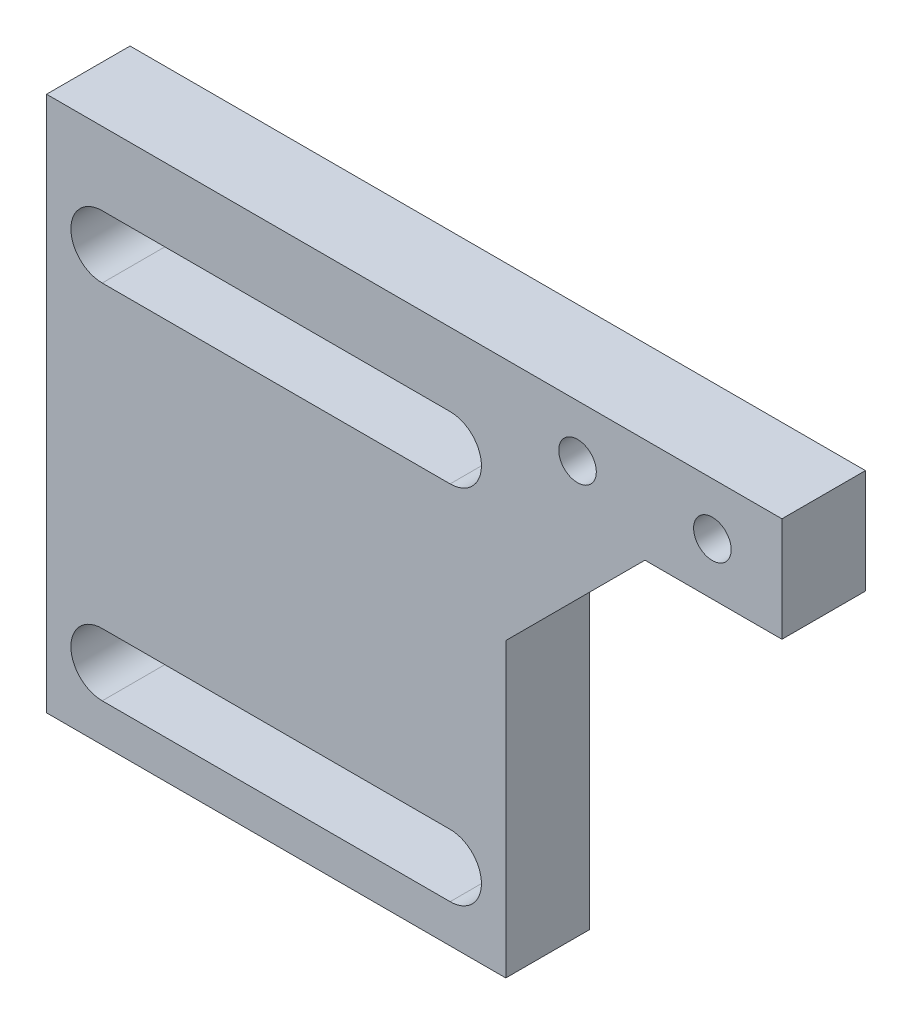
ISO-10303-21;
HEADER;
FILE_DESCRIPTION(('STEP AP214'),'2;1');
FILE_NAME('part.step','',(''),(''),'','','');
FILE_SCHEMA(('AUTOMOTIVE_DESIGN { 1 0 10303 214 1 1 1 1 }'));
ENDSEC;
DATA;
#1=APPLICATION_CONTEXT('core data for automotive mechanical design processes');
#2=APPLICATION_PROTOCOL_DEFINITION('international standard','automotive_design',2000,#1);
#3=PRODUCT_CONTEXT('',#1,'mechanical');
#4=PRODUCT('Part','Part','',(#3));
#5=PRODUCT_RELATED_PRODUCT_CATEGORY('part','',(#4));
#6=PRODUCT_DEFINITION_FORMATION('','',#4);
#7=PRODUCT_DEFINITION_CONTEXT('part definition',#1,'design');
#8=PRODUCT_DEFINITION('design','',#6,#7);
#9=PRODUCT_DEFINITION_SHAPE('','',#8);
#10=(LENGTH_UNIT() NAMED_UNIT(*) SI_UNIT(.MILLI.,.METRE.));
#11=(NAMED_UNIT(*) PLANE_ANGLE_UNIT() SI_UNIT($,.RADIAN.));
#12=(NAMED_UNIT(*) SI_UNIT($,.STERADIAN.) SOLID_ANGLE_UNIT());
#13=UNCERTAINTY_MEASURE_WITH_UNIT(LENGTH_MEASURE(1.E-05),#10,'distance_accuracy_value','');
#14=(GEOMETRIC_REPRESENTATION_CONTEXT(3) GLOBAL_UNCERTAINTY_ASSIGNED_CONTEXT((#13)) GLOBAL_UNIT_ASSIGNED_CONTEXT((#10,
#11,#12)) REPRESENTATION_CONTEXT('',''));
#15=CARTESIAN_POINT('',(0.,0.,0.));
#16=DIRECTION('',(0.,0.,1.));
#17=DIRECTION('',(1.,0.,0.));
#18=AXIS2_PLACEMENT_3D('',#15,#16,#17);
#19=CARTESIAN_POINT('',(0.,0.,6.));
#20=DIRECTION('',(0.,0.,-1.));
#21=DIRECTION('',(-1.,0.,0.));
#22=AXIS2_PLACEMENT_3D('',#19,#20,#21);
#23=PLANE('',#22);
#24=CARTESIAN_POINT('',(-48.845,-7.50000000000001,6.));
#25=DIRECTION('',(0.,0.,1.));
#26=DIRECTION('',(1.,0.,0.));
#27=AXIS2_PLACEMENT_3D('',#24,#25,#26);
#28=CIRCLE('',#27,2.25);
#29=CARTESIAN_POINT('',(-48.845,-5.25,6.));
#30=VERTEX_POINT('',#29);
#31=CARTESIAN_POINT('',(-48.845,-9.75000000000001,6.));
#32=VERTEX_POINT('',#31);
#33=EDGE_CURVE('E185',#30,#32,#28,.T.);
#34=ORIENTED_EDGE('',*,*,#33,.F.);
#35=DIRECTION('',(-1.,0.,0.));
#36=VECTOR('',#35,1.);
#37=CARTESIAN_POINT('',(-48.845,-5.25,6.));
#38=LINE('',#37,#36);
#39=CARTESIAN_POINT('',(-23.845,-5.25,6.));
#40=VERTEX_POINT('',#39);
#41=EDGE_CURVE('E193',#40,#30,#38,.T.);
#42=ORIENTED_EDGE('',*,*,#41,.F.);
#43=CARTESIAN_POINT('',(-23.845,-7.50000000000001,6.));
#44=DIRECTION('',(0.,0.,1.));
#45=DIRECTION('',(1.,0.,0.));
#46=AXIS2_PLACEMENT_3D('',#43,#44,#45);
#47=CIRCLE('',#46,2.25);
#48=CARTESIAN_POINT('',(-23.845,-9.75000000000001,6.));
#49=VERTEX_POINT('',#48);
#50=EDGE_CURVE('E190',#49,#40,#47,.T.);
#51=ORIENTED_EDGE('',*,*,#50,.F.);
#52=DIRECTION('',(1.,0.,0.));
#53=VECTOR('',#52,1.);
#54=CARTESIAN_POINT('',(-48.845,-9.75000000000001,6.));
#55=LINE('',#54,#53);
#56=EDGE_CURVE('E187',#32,#49,#55,.T.);
#57=ORIENTED_EDGE('',*,*,#56,.F.);
#58=EDGE_LOOP('',(#34,#42,#51,#57));
#59=FACE_BOUND('',#58,.T.);
#60=DIRECTION('',(0.,1.,0.));
#61=VECTOR('',#60,1.);
#62=CARTESIAN_POINT('',(0.,0.,6.));
#63=LINE('',#62,#61);
#64=CARTESIAN_POINT('',(0.,-7.5,6.));
#65=VERTEX_POINT('',#64);
#66=CARTESIAN_POINT('',(0.,0.,6.));
#67=VERTEX_POINT('',#66);
#68=EDGE_CURVE('E228',#65,#67,#63,.T.);
#69=ORIENTED_EDGE('',*,*,#68,.T.);
#70=DIRECTION('',(-1.,0.,0.));
#71=VECTOR('',#70,1.);
#72=CARTESIAN_POINT('',(-52.845,0.,6.));
#73=LINE('',#72,#71);
#74=CARTESIAN_POINT('',(-52.845,0.,6.));
#75=VERTEX_POINT('',#74);
#76=EDGE_CURVE('E231',#67,#75,#73,.T.);
#77=ORIENTED_EDGE('',*,*,#76,.T.);
#78=DIRECTION('',(0.,-1.,0.));
#79=VECTOR('',#78,1.);
#80=CARTESIAN_POINT('',(-52.845,0.,6.));
#81=LINE('',#80,#79);
#82=CARTESIAN_POINT('',(-52.845,-38.5,6.));
#83=VERTEX_POINT('',#82);
#84=EDGE_CURVE('E234',#75,#83,#81,.T.);
#85=ORIENTED_EDGE('',*,*,#84,.T.);
#86=DIRECTION('',(1.,0.,0.));
#87=VECTOR('',#86,1.);
#88=CARTESIAN_POINT('',(-19.845,-38.5,6.));
#89=LINE('',#88,#87);
#90=CARTESIAN_POINT('',(-19.845,-38.5,6.));
#91=VERTEX_POINT('',#90);
#92=EDGE_CURVE('E236',#83,#91,#89,.T.);
#93=ORIENTED_EDGE('',*,*,#92,.T.);
#94=DIRECTION('',(0.,1.,0.));
#95=VECTOR('',#94,1.);
#96=CARTESIAN_POINT('',(-19.845,-7.5,6.));
#97=LINE('',#96,#95);
#98=CARTESIAN_POINT('',(-19.845,-17.5,6.));
#99=VERTEX_POINT('',#98);
#100=EDGE_CURVE('E238',#91,#99,#97,.T.);
#101=ORIENTED_EDGE('',*,*,#100,.T.);
#102=DIRECTION('',(-0.707106781186551,-0.707106781186544,0.));
#103=VECTOR('',#102,1.);
#104=CARTESIAN_POINT('',(-1.17249999999992,1.17249999999993,6.));
#105=LINE('',#104,#103);
#106=CARTESIAN_POINT('',(-9.84499999999994,-7.5,6.));
#107=VERTEX_POINT('',#106);
#108=EDGE_CURVE('E11',#99,#107,#105,.F.);
#109=ORIENTED_EDGE('',*,*,#108,.T.);
#110=DIRECTION('',(1.,0.,0.));
#111=VECTOR('',#110,1.);
#112=CARTESIAN_POINT('',(0.,-7.5,6.));
#113=LINE('',#112,#111);
#114=EDGE_CURVE('E240',#107,#65,#113,.T.);
#115=ORIENTED_EDGE('',*,*,#114,.T.);
#116=EDGE_LOOP('',(#69,#77,#85,#93,#101,#109,#115));
#117=FACE_BOUND('',#116,.T.);
#118=CARTESIAN_POINT('',(-14.69,-3.75,6.));
#119=DIRECTION('',(0.,0.,1.));
#120=DIRECTION('',(1.,0.,0.));
#121=AXIS2_PLACEMENT_3D('',#118,#119,#120);
#122=CIRCLE('',#121,1.35);
#123=CARTESIAN_POINT('',(-13.34,-3.75,6.));
#124=VERTEX_POINT('',#123);
#125=EDGE_CURVE('E222',#124,#124,#122,.T.);
#126=ORIENTED_EDGE('',*,*,#125,.F.);
#127=EDGE_LOOP('',(#126));
#128=FACE_BOUND('',#127,.T.);
#129=CARTESIAN_POINT('',(-5.,-3.75,6.));
#130=DIRECTION('',(0.,0.,1.));
#131=DIRECTION('',(1.,0.,0.));
#132=AXIS2_PLACEMENT_3D('',#129,#130,#131);
#133=CIRCLE('',#132,1.35);
#134=CARTESIAN_POINT('',(-3.65,-3.75,6.));
#135=VERTEX_POINT('',#134);
#136=EDGE_CURVE('E216',#135,#135,#133,.T.);
#137=ORIENTED_EDGE('',*,*,#136,.F.);
#138=EDGE_LOOP('',(#137));
#139=FACE_BOUND('',#138,.T.);
#140=CARTESIAN_POINT('',(-48.845,-33.5,6.));
#141=DIRECTION('',(0.,0.,1.));
#142=DIRECTION('',(1.,0.,0.));
#143=AXIS2_PLACEMENT_3D('',#140,#141,#142);
#144=CIRCLE('',#143,2.25);
#145=CARTESIAN_POINT('',(-48.845,-31.25,6.));
#146=VERTEX_POINT('',#145);
#147=CARTESIAN_POINT('',(-48.845,-35.75,6.));
#148=VERTEX_POINT('',#147);
#149=EDGE_CURVE('E144',#146,#148,#144,.T.);
#150=ORIENTED_EDGE('',*,*,#149,.F.);
#151=DIRECTION('',(-1.,0.,0.));
#152=VECTOR('',#151,1.);
#153=CARTESIAN_POINT('',(-48.845,-31.25,6.));
#154=LINE('',#153,#152);
#155=CARTESIAN_POINT('',(-23.845,-31.25,6.));
#156=VERTEX_POINT('',#155);
#157=EDGE_CURVE('E169',#156,#146,#154,.T.);
#158=ORIENTED_EDGE('',*,*,#157,.F.);
#159=CARTESIAN_POINT('',(-23.845,-33.5,6.));
#160=DIRECTION('',(0.,0.,1.));
#161=DIRECTION('',(1.,0.,0.));
#162=AXIS2_PLACEMENT_3D('',#159,#160,#161);
#163=CIRCLE('',#162,2.25);
#164=CARTESIAN_POINT('',(-23.845,-35.75,6.));
#165=VERTEX_POINT('',#164);
#166=EDGE_CURVE('E167',#165,#156,#163,.T.);
#167=ORIENTED_EDGE('',*,*,#166,.F.);
#168=DIRECTION('',(1.,0.,0.));
#169=VECTOR('',#168,1.);
#170=CARTESIAN_POINT('',(-48.845,-35.75,6.));
#171=LINE('',#170,#169);
#172=EDGE_CURVE('E154',#148,#165,#171,.T.);
#173=ORIENTED_EDGE('',*,*,#172,.F.);
#174=EDGE_LOOP('',(#150,#158,#167,#173));
#175=FACE_BOUND('',#174,.T.);
#176=ADVANCED_FACE('F36',(#59,#117,#128,#139,#175),#23,.F.);
#177=CARTESIAN_POINT('',(0.,0.,0.));
#178=DIRECTION('',(0.,0.,-1.));
#179=DIRECTION('',(-1.,0.,0.));
#180=AXIS2_PLACEMENT_3D('',#177,#178,#179);
#181=PLANE('',#180);
#182=CARTESIAN_POINT('',(-14.69,-3.75,0.));
#183=DIRECTION('',(0.,0.,1.));
#184=DIRECTION('',(1.,0.,0.));
#185=AXIS2_PLACEMENT_3D('',#182,#183,#184);
#186=CIRCLE('',#185,1.35);
#187=CARTESIAN_POINT('',(-13.34,-3.75,0.));
#188=VERTEX_POINT('',#187);
#189=EDGE_CURVE('E219',#188,#188,#186,.T.);
#190=ORIENTED_EDGE('',*,*,#189,.T.);
#191=EDGE_LOOP('',(#190));
#192=FACE_BOUND('',#191,.T.);
#193=DIRECTION('',(0.,1.,0.));
#194=VECTOR('',#193,1.);
#195=CARTESIAN_POINT('',(0.,0.,0.));
#196=LINE('',#195,#194);
#197=CARTESIAN_POINT('',(0.,-7.5,0.));
#198=VERTEX_POINT('',#197);
#199=CARTESIAN_POINT('',(0.,0.,0.));
#200=VERTEX_POINT('',#199);
#201=EDGE_CURVE('E225',#198,#200,#196,.T.);
#202=ORIENTED_EDGE('',*,*,#201,.F.);
#203=DIRECTION('',(1.,0.,0.));
#204=VECTOR('',#203,1.);
#205=CARTESIAN_POINT('',(0.,-7.5,0.));
#206=LINE('',#205,#204);
#207=CARTESIAN_POINT('',(-9.84499999999994,-7.5,0.));
#208=VERTEX_POINT('',#207);
#209=EDGE_CURVE('E232',#208,#198,#206,.T.);
#210=ORIENTED_EDGE('',*,*,#209,.F.);
#211=DIRECTION('',(0.707106781186551,0.707106781186544,0.));
#212=VECTOR('',#211,1.);
#213=CARTESIAN_POINT('',(-9.84499999999994,-7.5,0.));
#214=LINE('',#213,#212);
#215=CARTESIAN_POINT('',(-19.845,-17.5,0.));
#216=VERTEX_POINT('',#215);
#217=EDGE_CURVE('E44',#208,#216,#214,.F.);
#218=ORIENTED_EDGE('',*,*,#217,.T.);
#219=DIRECTION('',(0.,1.,0.));
#220=VECTOR('',#219,1.);
#221=CARTESIAN_POINT('',(-19.845,-7.5,0.));
#222=LINE('',#221,#220);
#223=CARTESIAN_POINT('',(-19.845,-38.5,0.));
#224=VERTEX_POINT('',#223);
#225=EDGE_CURVE('E251',#224,#216,#222,.T.);
#226=ORIENTED_EDGE('',*,*,#225,.F.);
#227=DIRECTION('',(1.,0.,0.));
#228=VECTOR('',#227,1.);
#229=CARTESIAN_POINT('',(-19.845,-38.5,0.));
#230=LINE('',#229,#228);
#231=CARTESIAN_POINT('',(-52.845,-38.5,0.));
#232=VERTEX_POINT('',#231);
#233=EDGE_CURVE('E249',#232,#224,#230,.T.);
#234=ORIENTED_EDGE('',*,*,#233,.F.);
#235=DIRECTION('',(0.,-1.,0.));
#236=VECTOR('',#235,1.);
#237=CARTESIAN_POINT('',(-52.845,0.,0.));
#238=LINE('',#237,#236);
#239=CARTESIAN_POINT('',(-52.845,0.,0.));
#240=VERTEX_POINT('',#239);
#241=EDGE_CURVE('E247',#240,#232,#238,.T.);
#242=ORIENTED_EDGE('',*,*,#241,.F.);
#243=DIRECTION('',(-1.,0.,0.));
#244=VECTOR('',#243,1.);
#245=CARTESIAN_POINT('',(-52.845,0.,0.));
#246=LINE('',#245,#244);
#247=EDGE_CURVE('E245',#200,#240,#246,.T.);
#248=ORIENTED_EDGE('',*,*,#247,.F.);
#249=EDGE_LOOP('',(#202,#210,#218,#226,#234,#242,#248));
#250=FACE_BOUND('',#249,.T.);
#251=CARTESIAN_POINT('',(-5.,-3.75,0.));
#252=DIRECTION('',(0.,0.,1.));
#253=DIRECTION('',(1.,0.,0.));
#254=AXIS2_PLACEMENT_3D('',#251,#252,#253);
#255=CIRCLE('',#254,1.35);
#256=CARTESIAN_POINT('',(-3.65,-3.75,0.));
#257=VERTEX_POINT('',#256);
#258=EDGE_CURVE('E215',#257,#257,#255,.T.);
#259=ORIENTED_EDGE('',*,*,#258,.T.);
#260=EDGE_LOOP('',(#259));
#261=FACE_BOUND('',#260,.T.);
#262=DIRECTION('',(-1.,0.,0.));
#263=VECTOR('',#262,1.);
#264=CARTESIAN_POINT('',(-48.845,-5.25,0.));
#265=LINE('',#264,#263);
#266=CARTESIAN_POINT('',(-23.845,-5.25,0.));
#267=VERTEX_POINT('',#266);
#268=CARTESIAN_POINT('',(-48.845,-5.25,0.));
#269=VERTEX_POINT('',#268);
#270=EDGE_CURVE('E188',#267,#269,#265,.T.);
#271=ORIENTED_EDGE('',*,*,#270,.T.);
#272=CARTESIAN_POINT('',(-48.845,-7.50000000000001,0.));
#273=DIRECTION('',(0.,0.,1.));
#274=DIRECTION('',(1.,0.,0.));
#275=AXIS2_PLACEMENT_3D('',#272,#273,#274);
#276=CIRCLE('',#275,2.25);
#277=CARTESIAN_POINT('',(-48.845,-9.75000000000001,0.));
#278=VERTEX_POINT('',#277);
#279=EDGE_CURVE('E162',#269,#278,#276,.T.);
#280=ORIENTED_EDGE('',*,*,#279,.T.);
#281=DIRECTION('',(1.,0.,0.));
#282=VECTOR('',#281,1.);
#283=CARTESIAN_POINT('',(-48.845,-9.75000000000001,0.));
#284=LINE('',#283,#282);
#285=CARTESIAN_POINT('',(-23.845,-9.75000000000001,0.));
#286=VERTEX_POINT('',#285);
#287=EDGE_CURVE('E198',#278,#286,#284,.T.);
#288=ORIENTED_EDGE('',*,*,#287,.T.);
#289=CARTESIAN_POINT('',(-23.845,-7.50000000000001,0.));
#290=DIRECTION('',(0.,0.,1.));
#291=DIRECTION('',(1.,0.,0.));
#292=AXIS2_PLACEMENT_3D('',#289,#290,#291);
#293=CIRCLE('',#292,2.25);
#294=EDGE_CURVE('E201',#286,#267,#293,.T.);
#295=ORIENTED_EDGE('',*,*,#294,.T.);
#296=EDGE_LOOP('',(#271,#280,#288,#295));
#297=FACE_BOUND('',#296,.T.);
#298=DIRECTION('',(-1.,0.,0.));
#299=VECTOR('',#298,1.);
#300=CARTESIAN_POINT('',(-48.845,-31.25,0.));
#301=LINE('',#300,#299);
#302=CARTESIAN_POINT('',(-23.845,-31.25,0.));
#303=VERTEX_POINT('',#302);
#304=CARTESIAN_POINT('',(-48.845,-31.25,0.));
#305=VERTEX_POINT('',#304);
#306=EDGE_CURVE('E155',#303,#305,#301,.T.);
#307=ORIENTED_EDGE('',*,*,#306,.T.);
#308=CARTESIAN_POINT('',(-48.845,-33.5,0.));
#309=DIRECTION('',(0.,0.,1.));
#310=DIRECTION('',(1.,0.,0.));
#311=AXIS2_PLACEMENT_3D('',#308,#309,#310);
#312=CIRCLE('',#311,2.25);
#313=CARTESIAN_POINT('',(-48.845,-35.75,0.));
#314=VERTEX_POINT('',#313);
#315=EDGE_CURVE('E173',#305,#314,#312,.T.);
#316=ORIENTED_EDGE('',*,*,#315,.T.);
#317=DIRECTION('',(1.,0.,0.));
#318=VECTOR('',#317,1.);
#319=CARTESIAN_POINT('',(-48.845,-35.75,0.));
#320=LINE('',#319,#318);
#321=CARTESIAN_POINT('',(-23.845,-35.75,0.));
#322=VERTEX_POINT('',#321);
#323=EDGE_CURVE('E161',#314,#322,#320,.T.);
#324=ORIENTED_EDGE('',*,*,#323,.T.);
#325=CARTESIAN_POINT('',(-23.845,-33.5,0.));
#326=DIRECTION('',(0.,0.,1.));
#327=DIRECTION('',(1.,0.,0.));
#328=AXIS2_PLACEMENT_3D('',#325,#326,#327);
#329=CIRCLE('',#328,2.25);
#330=EDGE_CURVE('E176',#322,#303,#329,.T.);
#331=ORIENTED_EDGE('',*,*,#330,.T.);
#332=EDGE_LOOP('',(#307,#316,#324,#331));
#333=FACE_BOUND('',#332,.T.);
#334=ADVANCED_FACE('F279',(#192,#250,#261,#297,#333),#181,.T.);
#335=CARTESIAN_POINT('',(0.,0.,6.));
#336=DIRECTION('',(-1.,0.,0.));
#337=DIRECTION('',(0.,0.,1.));
#338=AXIS2_PLACEMENT_3D('',#335,#336,#337);
#339=PLANE('',#338);
#340=ORIENTED_EDGE('',*,*,#201,.T.);
#341=DIRECTION('',(0.,0.,-1.));
#342=VECTOR('',#341,1.);
#343=CARTESIAN_POINT('',(0.,0.,6.));
#344=LINE('',#343,#342);
#345=EDGE_CURVE('E265',#67,#200,#344,.T.);
#346=ORIENTED_EDGE('',*,*,#345,.F.);
#347=ORIENTED_EDGE('',*,*,#68,.F.);
#348=DIRECTION('',(0.,0.,-1.));
#349=VECTOR('',#348,1.);
#350=CARTESIAN_POINT('',(0.,-7.5,6.));
#351=LINE('',#350,#349);
#352=EDGE_CURVE('E242',#65,#198,#351,.T.);
#353=ORIENTED_EDGE('',*,*,#352,.T.);
#354=EDGE_LOOP('',(#340,#346,#347,#353));
#355=FACE_BOUND('',#354,.T.);
#356=ADVANCED_FACE('F284',(#355),#339,.F.);
#357=CARTESIAN_POINT('',(-52.845,0.,6.));
#358=DIRECTION('',(0.,-1.,0.));
#359=DIRECTION('',(0.,0.,-1.));
#360=AXIS2_PLACEMENT_3D('',#357,#358,#359);
#361=PLANE('',#360);
#362=ORIENTED_EDGE('',*,*,#247,.T.);
#363=DIRECTION('',(0.,0.,-1.));
#364=VECTOR('',#363,1.);
#365=CARTESIAN_POINT('',(-52.845,0.,6.));
#366=LINE('',#365,#364);
#367=EDGE_CURVE('E262',#75,#240,#366,.T.);
#368=ORIENTED_EDGE('',*,*,#367,.F.);
#369=ORIENTED_EDGE('',*,*,#76,.F.);
#370=ORIENTED_EDGE('',*,*,#345,.T.);
#371=EDGE_LOOP('',(#362,#368,#369,#370));
#372=FACE_BOUND('',#371,.T.);
#373=ADVANCED_FACE('F322',(#372),#361,.F.);
#374=CARTESIAN_POINT('',(-52.845,0.,6.));
#375=DIRECTION('',(1.,0.,0.));
#376=DIRECTION('',(0.,0.,-1.));
#377=AXIS2_PLACEMENT_3D('',#374,#375,#376);
#378=PLANE('',#377);
#379=ORIENTED_EDGE('',*,*,#241,.T.);
#380=DIRECTION('',(0.,0.,-1.));
#381=VECTOR('',#380,1.);
#382=CARTESIAN_POINT('',(-52.845,-38.5,6.));
#383=LINE('',#382,#381);
#384=EDGE_CURVE('E259',#83,#232,#383,.T.);
#385=ORIENTED_EDGE('',*,*,#384,.F.);
#386=ORIENTED_EDGE('',*,*,#84,.F.);
#387=ORIENTED_EDGE('',*,*,#367,.T.);
#388=EDGE_LOOP('',(#379,#385,#386,#387));
#389=FACE_BOUND('',#388,.T.);
#390=ADVANCED_FACE('F318',(#389),#378,.F.);
#391=CARTESIAN_POINT('',(-19.845,-38.5,6.));
#392=DIRECTION('',(0.,1.,0.));
#393=DIRECTION('',(-1.,0.,0.));
#394=AXIS2_PLACEMENT_3D('',#391,#392,#393);
#395=PLANE('',#394);
#396=ORIENTED_EDGE('',*,*,#233,.T.);
#397=DIRECTION('',(0.,0.,-1.));
#398=VECTOR('',#397,1.);
#399=CARTESIAN_POINT('',(-19.845,-38.5,6.));
#400=LINE('',#399,#398);
#401=EDGE_CURVE('E256',#91,#224,#400,.T.);
#402=ORIENTED_EDGE('',*,*,#401,.F.);
#403=ORIENTED_EDGE('',*,*,#92,.F.);
#404=ORIENTED_EDGE('',*,*,#384,.T.);
#405=EDGE_LOOP('',(#396,#402,#403,#404));
#406=FACE_BOUND('',#405,.T.);
#407=ADVANCED_FACE('F315',(#406),#395,.F.);
#408=CARTESIAN_POINT('',(-19.845,-7.5,6.));
#409=DIRECTION('',(-1.,0.,0.));
#410=DIRECTION('',(0.,-1.,0.));
#411=AXIS2_PLACEMENT_3D('',#408,#409,#410);
#412=PLANE('',#411);
#413=ORIENTED_EDGE('',*,*,#225,.T.);
#414=DIRECTION('',(0.,0.,1.));
#415=VECTOR('',#414,1.);
#416=CARTESIAN_POINT('',(-19.845,-17.5,6.));
#417=LINE('',#416,#415);
#418=EDGE_CURVE('E51',#216,#99,#417,.T.);
#419=ORIENTED_EDGE('',*,*,#418,.T.);
#420=ORIENTED_EDGE('',*,*,#100,.F.);
#421=ORIENTED_EDGE('',*,*,#401,.T.);
#422=EDGE_LOOP('',(#413,#419,#420,#421));
#423=FACE_BOUND('',#422,.T.);
#424=ADVANCED_FACE('F312',(#423),#412,.F.);
#425=CARTESIAN_POINT('',(0.,-7.5,6.));
#426=DIRECTION('',(0.,1.,0.));
#427=DIRECTION('',(-1.,0.,0.));
#428=AXIS2_PLACEMENT_3D('',#425,#426,#427);
#429=PLANE('',#428);
#430=ORIENTED_EDGE('',*,*,#114,.F.);
#431=DIRECTION('',(0.,0.,-1.));
#432=VECTOR('',#431,1.);
#433=CARTESIAN_POINT('',(-9.84499999999994,-7.5,0.));
#434=LINE('',#433,#432);
#435=EDGE_CURVE('E268',#107,#208,#434,.T.);
#436=ORIENTED_EDGE('',*,*,#435,.T.);
#437=ORIENTED_EDGE('',*,*,#209,.T.);
#438=ORIENTED_EDGE('',*,*,#352,.F.);
#439=EDGE_LOOP('',(#430,#436,#437,#438));
#440=FACE_BOUND('',#439,.T.);
#441=ADVANCED_FACE('F274',(#440),#429,.F.);
#442=CARTESIAN_POINT('',(-14.69,-3.75,6.));
#443=DIRECTION('',(0.,0.,-1.));
#444=DIRECTION('',(-1.,0.,0.));
#445=AXIS2_PLACEMENT_3D('',#442,#443,#444);
#446=CYLINDRICAL_SURFACE('',#445,1.35);
#447=ORIENTED_EDGE('',*,*,#125,.T.);
#448=EDGE_LOOP('',(#447));
#449=FACE_BOUND('',#448,.T.);
#450=ORIENTED_EDGE('',*,*,#189,.F.);
#451=EDGE_LOOP('',(#450));
#452=FACE_BOUND('',#451,.T.);
#453=ADVANCED_FACE('F307',(#449,#452),#446,.F.);
#454=CARTESIAN_POINT('',(-5.,-3.75,6.));
#455=DIRECTION('',(0.,0.,-1.));
#456=DIRECTION('',(-1.,0.,0.));
#457=AXIS2_PLACEMENT_3D('',#454,#455,#456);
#458=CYLINDRICAL_SURFACE('',#457,1.35);
#459=ORIENTED_EDGE('',*,*,#136,.T.);
#460=EDGE_LOOP('',(#459));
#461=FACE_BOUND('',#460,.T.);
#462=ORIENTED_EDGE('',*,*,#258,.F.);
#463=EDGE_LOOP('',(#462));
#464=FACE_BOUND('',#463,.T.);
#465=ADVANCED_FACE('F357',(#461,#464),#458,.F.);
#466=CARTESIAN_POINT('',(-48.845,-7.50000000000001,6.));
#467=DIRECTION('',(0.,0.,-1.));
#468=DIRECTION('',(-1.,0.,0.));
#469=AXIS2_PLACEMENT_3D('',#466,#467,#468);
#470=CYLINDRICAL_SURFACE('',#469,2.25);
#471=ORIENTED_EDGE('',*,*,#279,.F.);
#472=DIRECTION('',(0.,0.,-1.));
#473=VECTOR('',#472,1.);
#474=CARTESIAN_POINT('',(-48.845,-5.25,6.));
#475=LINE('',#474,#473);
#476=EDGE_CURVE('E195',#30,#269,#475,.T.);
#477=ORIENTED_EDGE('',*,*,#476,.F.);
#478=ORIENTED_EDGE('',*,*,#33,.T.);
#479=DIRECTION('',(0.,0.,-1.));
#480=VECTOR('',#479,1.);
#481=CARTESIAN_POINT('',(-48.845,-9.75000000000001,6.));
#482=LINE('',#481,#480);
#483=EDGE_CURVE('E212',#32,#278,#482,.T.);
#484=ORIENTED_EDGE('',*,*,#483,.T.);
#485=EDGE_LOOP('',(#471,#477,#478,#484));
#486=FACE_BOUND('',#485,.T.);
#487=ADVANCED_FACE('F364',(#486),#470,.F.);
#488=CARTESIAN_POINT('',(-48.845,-9.75000000000001,6.));
#489=DIRECTION('',(0.,1.,0.));
#490=DIRECTION('',(0.,0.,1.));
#491=AXIS2_PLACEMENT_3D('',#488,#489,#490);
#492=PLANE('',#491);
#493=ORIENTED_EDGE('',*,*,#287,.F.);
#494=ORIENTED_EDGE('',*,*,#483,.F.);
#495=ORIENTED_EDGE('',*,*,#56,.T.);
#496=DIRECTION('',(0.,0.,-1.));
#497=VECTOR('',#496,1.);
#498=CARTESIAN_POINT('',(-23.845,-9.75000000000001,6.));
#499=LINE('',#498,#497);
#500=EDGE_CURVE('E210',#49,#286,#499,.T.);
#501=ORIENTED_EDGE('',*,*,#500,.T.);
#502=EDGE_LOOP('',(#493,#494,#495,#501));
#503=FACE_BOUND('',#502,.T.);
#504=ADVANCED_FACE('F371',(#503),#492,.T.);
#505=CARTESIAN_POINT('',(-23.845,-7.50000000000001,6.));
#506=DIRECTION('',(0.,0.,-1.));
#507=DIRECTION('',(-1.,0.,0.));
#508=AXIS2_PLACEMENT_3D('',#505,#506,#507);
#509=CYLINDRICAL_SURFACE('',#508,2.25);
#510=ORIENTED_EDGE('',*,*,#294,.F.);
#511=ORIENTED_EDGE('',*,*,#500,.F.);
#512=ORIENTED_EDGE('',*,*,#50,.T.);
#513=DIRECTION('',(0.,0.,-1.));
#514=VECTOR('',#513,1.);
#515=CARTESIAN_POINT('',(-23.845,-5.25,6.));
#516=LINE('',#515,#514);
#517=EDGE_CURVE('E208',#40,#267,#516,.T.);
#518=ORIENTED_EDGE('',*,*,#517,.T.);
#519=EDGE_LOOP('',(#510,#511,#512,#518));
#520=FACE_BOUND('',#519,.T.);
#521=ADVANCED_FACE('F379',(#520),#509,.F.);
#522=CARTESIAN_POINT('',(-48.845,-5.25,6.));
#523=DIRECTION('',(0.,-1.,0.));
#524=DIRECTION('',(0.,0.,-1.));
#525=AXIS2_PLACEMENT_3D('',#522,#523,#524);
#526=PLANE('',#525);
#527=ORIENTED_EDGE('',*,*,#270,.F.);
#528=ORIENTED_EDGE('',*,*,#517,.F.);
#529=ORIENTED_EDGE('',*,*,#41,.T.);
#530=ORIENTED_EDGE('',*,*,#476,.T.);
#531=EDGE_LOOP('',(#527,#528,#529,#530));
#532=FACE_BOUND('',#531,.T.);
#533=ADVANCED_FACE('F387',(#532),#526,.T.);
#534=CARTESIAN_POINT('',(-48.845,-33.5,6.));
#535=DIRECTION('',(0.,0.,-1.));
#536=DIRECTION('',(-1.,0.,0.));
#537=AXIS2_PLACEMENT_3D('',#534,#535,#536);
#538=CYLINDRICAL_SURFACE('',#537,2.25);
#539=ORIENTED_EDGE('',*,*,#315,.F.);
#540=DIRECTION('',(0.,0.,-1.));
#541=VECTOR('',#540,1.);
#542=CARTESIAN_POINT('',(-48.845,-31.25,6.));
#543=LINE('',#542,#541);
#544=EDGE_CURVE('E150',#146,#305,#543,.T.);
#545=ORIENTED_EDGE('',*,*,#544,.F.);
#546=ORIENTED_EDGE('',*,*,#149,.T.);
#547=DIRECTION('',(0.,0.,-1.));
#548=VECTOR('',#547,1.);
#549=CARTESIAN_POINT('',(-48.845,-35.75,6.));
#550=LINE('',#549,#548);
#551=EDGE_CURVE('E147',#148,#314,#550,.T.);
#552=ORIENTED_EDGE('',*,*,#551,.T.);
#553=EDGE_LOOP('',(#539,#545,#546,#552));
#554=FACE_BOUND('',#553,.T.);
#555=ADVANCED_FACE('F146',(#554),#538,.F.);
#556=CARTESIAN_POINT('',(-48.845,-35.75,6.));
#557=DIRECTION('',(0.,1.,0.));
#558=DIRECTION('',(0.,0.,1.));
#559=AXIS2_PLACEMENT_3D('',#556,#557,#558);
#560=PLANE('',#559);
#561=ORIENTED_EDGE('',*,*,#323,.F.);
#562=ORIENTED_EDGE('',*,*,#551,.F.);
#563=ORIENTED_EDGE('',*,*,#172,.T.);
#564=DIRECTION('',(0.,0.,-1.));
#565=VECTOR('',#564,1.);
#566=CARTESIAN_POINT('',(-23.845,-35.75,6.));
#567=LINE('',#566,#565);
#568=EDGE_CURVE('E163',#165,#322,#567,.T.);
#569=ORIENTED_EDGE('',*,*,#568,.T.);
#570=EDGE_LOOP('',(#561,#562,#563,#569));
#571=FACE_BOUND('',#570,.T.);
#572=ADVANCED_FACE('F158',(#571),#560,.T.);
#573=CARTESIAN_POINT('',(-23.845,-33.5,6.));
#574=DIRECTION('',(0.,0.,-1.));
#575=DIRECTION('',(-1.,0.,0.));
#576=AXIS2_PLACEMENT_3D('',#573,#574,#575);
#577=CYLINDRICAL_SURFACE('',#576,2.25);
#578=ORIENTED_EDGE('',*,*,#330,.F.);
#579=ORIENTED_EDGE('',*,*,#568,.F.);
#580=ORIENTED_EDGE('',*,*,#166,.T.);
#581=DIRECTION('',(0.,0.,-1.));
#582=VECTOR('',#581,1.);
#583=CARTESIAN_POINT('',(-23.845,-31.25,6.));
#584=LINE('',#583,#582);
#585=EDGE_CURVE('E182',#156,#303,#584,.T.);
#586=ORIENTED_EDGE('',*,*,#585,.T.);
#587=EDGE_LOOP('',(#578,#579,#580,#586));
#588=FACE_BOUND('',#587,.T.);
#589=ADVANCED_FACE('F294',(#588),#577,.F.);
#590=CARTESIAN_POINT('',(-48.845,-31.25,6.));
#591=DIRECTION('',(0.,-1.,0.));
#592=DIRECTION('',(0.,0.,-1.));
#593=AXIS2_PLACEMENT_3D('',#590,#591,#592);
#594=PLANE('',#593);
#595=ORIENTED_EDGE('',*,*,#306,.F.);
#596=ORIENTED_EDGE('',*,*,#585,.F.);
#597=ORIENTED_EDGE('',*,*,#157,.T.);
#598=ORIENTED_EDGE('',*,*,#544,.T.);
#599=EDGE_LOOP('',(#595,#596,#597,#598));
#600=FACE_BOUND('',#599,.T.);
#601=ADVANCED_FACE('F290',(#600),#594,.T.);
#602=CARTESIAN_POINT('',(-9.84499999999994,-7.5,6.));
#603=DIRECTION('',(0.707106781186544,-0.707106781186551,0.));
#604=DIRECTION('',(0.,0.,1.));
#605=AXIS2_PLACEMENT_3D('',#602,#603,#604);
#606=PLANE('',#605);
#607=ORIENTED_EDGE('',*,*,#108,.F.);
#608=ORIENTED_EDGE('',*,*,#418,.F.);
#609=ORIENTED_EDGE('',*,*,#217,.F.);
#610=ORIENTED_EDGE('',*,*,#435,.F.);
#611=EDGE_LOOP('',(#607,#608,#609,#610));
#612=FACE_BOUND('',#611,.T.);
#613=ADVANCED_FACE('F38',(#612),#606,.T.);
#614=CLOSED_SHELL('',(#176,#334,#356,#373,#390,#407,#424,#441,#453,#465,#487,#504,#521,#533,
#555,#572,#589,#601,#613));
#615=MANIFOLD_SOLID_BREP('B2',#614);
#616=ADVANCED_BREP_SHAPE_REPRESENTATION('',(#18,#615),#14);
#617=SHAPE_DEFINITION_REPRESENTATION(#9,#616);
ENDSEC;
END-ISO-10303-21;
